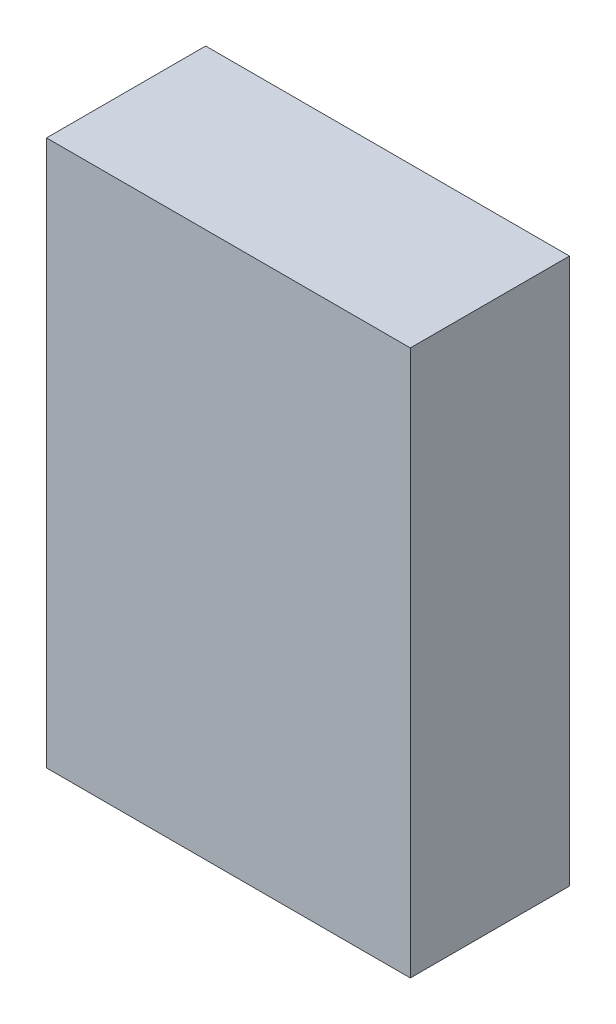
ISO-10303-21;
HEADER;
FILE_DESCRIPTION(('STEP AP214'),'2;1');
FILE_NAME('part.step','',(''),(''),'','','');
FILE_SCHEMA(('AUTOMOTIVE_DESIGN { 1 0 10303 214 1 1 1 1 }'));
ENDSEC;
DATA;
#1=APPLICATION_CONTEXT('core data for automotive mechanical design processes');
#2=APPLICATION_PROTOCOL_DEFINITION('international standard','automotive_design',2000,#1);
#3=PRODUCT_CONTEXT('',#1,'mechanical');
#4=PRODUCT('Part','Part','',(#3));
#5=PRODUCT_RELATED_PRODUCT_CATEGORY('part','',(#4));
#6=PRODUCT_DEFINITION_FORMATION('','',#4);
#7=PRODUCT_DEFINITION_CONTEXT('part definition',#1,'design');
#8=PRODUCT_DEFINITION('design','',#6,#7);
#9=PRODUCT_DEFINITION_SHAPE('','',#8);
#10=(LENGTH_UNIT() NAMED_UNIT(*) SI_UNIT(.MILLI.,.METRE.));
#11=(NAMED_UNIT(*) PLANE_ANGLE_UNIT() SI_UNIT($,.RADIAN.));
#12=(NAMED_UNIT(*) SI_UNIT($,.STERADIAN.) SOLID_ANGLE_UNIT());
#13=UNCERTAINTY_MEASURE_WITH_UNIT(LENGTH_MEASURE(1.E-05),#10,'distance_accuracy_value','');
#14=(GEOMETRIC_REPRESENTATION_CONTEXT(3) GLOBAL_UNCERTAINTY_ASSIGNED_CONTEXT((#13)) GLOBAL_UNIT_ASSIGNED_CONTEXT((#10,
#11,#12)) REPRESENTATION_CONTEXT('',''));
#15=CARTESIAN_POINT('',(0.,0.,0.));
#16=DIRECTION('',(0.,0.,1.));
#17=DIRECTION('',(1.,0.,0.));
#18=AXIS2_PLACEMENT_3D('',#15,#16,#17);
#19=CARTESIAN_POINT('',(0.,0.,0.0875));
#20=DIRECTION('',(0.,0.,1.));
#21=DIRECTION('',(1.,0.,0.));
#22=AXIS2_PLACEMENT_3D('',#19,#20,#21);
#23=PLANE('',#22);
#24=DIRECTION('',(0.,1.,0.));
#25=VECTOR('',#24,1.);
#26=CARTESIAN_POINT('',(0.2,0.,0.0875));
#27=LINE('',#26,#25);
#28=CARTESIAN_POINT('',(0.2,0.3,0.0875));
#29=VERTEX_POINT('',#28);
#30=CARTESIAN_POINT('',(0.2,0.,0.0875));
#31=VERTEX_POINT('',#30);
#32=EDGE_CURVE('E76',#29,#31,#27,.F.);
#33=ORIENTED_EDGE('',*,*,#32,.F.);
#34=DIRECTION('',(1.,0.,0.));
#35=VECTOR('',#34,1.);
#36=CARTESIAN_POINT('',(0.,0.3,0.0875));
#37=LINE('',#36,#35);
#38=CARTESIAN_POINT('',(0.,0.3,0.0875));
#39=VERTEX_POINT('',#38);
#40=EDGE_CURVE('E58',#39,#29,#37,.T.);
#41=ORIENTED_EDGE('',*,*,#40,.F.);
#42=DIRECTION('',(0.,1.,0.));
#43=VECTOR('',#42,1.);
#44=CARTESIAN_POINT('',(0.,0.,0.0875));
#45=LINE('',#44,#43);
#46=CARTESIAN_POINT('',(0.,0.,0.0875));
#47=VERTEX_POINT('',#46);
#48=EDGE_CURVE('E20',#39,#47,#45,.F.);
#49=ORIENTED_EDGE('',*,*,#48,.T.);
#50=DIRECTION('',(1.,0.,0.));
#51=VECTOR('',#50,1.);
#52=CARTESIAN_POINT('',(0.,0.,0.0875));
#53=LINE('',#52,#51);
#54=EDGE_CURVE('E55',#47,#31,#53,.T.);
#55=ORIENTED_EDGE('',*,*,#54,.T.);
#56=EDGE_LOOP('',(#33,#41,#49,#55));
#57=FACE_BOUND('',#56,.T.);
#58=ADVANCED_FACE('F17',(#57),#23,.T.);
#59=CARTESIAN_POINT('',(0.,0.,0.));
#60=DIRECTION('',(1.,0.,0.));
#61=DIRECTION('',(0.,0.,-1.));
#62=AXIS2_PLACEMENT_3D('',#59,#60,#61);
#63=PLANE('',#62);
#64=DIRECTION('',(0.,0.,1.));
#65=VECTOR('',#64,1.);
#66=CARTESIAN_POINT('',(0.,0.3,0.));
#67=LINE('',#66,#65);
#68=CARTESIAN_POINT('',(0.,0.3,0.));
#69=VERTEX_POINT('',#68);
#70=EDGE_CURVE('E78',#69,#39,#67,.T.);
#71=ORIENTED_EDGE('',*,*,#70,.F.);
#72=DIRECTION('',(0.,1.,0.));
#73=VECTOR('',#72,1.);
#74=CARTESIAN_POINT('',(0.,0.,0.));
#75=LINE('',#74,#73);
#76=CARTESIAN_POINT('',(0.,0.,0.));
#77=VERTEX_POINT('',#76);
#78=EDGE_CURVE('E73',#69,#77,#75,.F.);
#79=ORIENTED_EDGE('',*,*,#78,.T.);
#80=DIRECTION('',(0.,0.,1.));
#81=VECTOR('',#80,1.);
#82=CARTESIAN_POINT('',(0.,0.,0.));
#83=LINE('',#82,#81);
#84=EDGE_CURVE('E63',#77,#47,#83,.T.);
#85=ORIENTED_EDGE('',*,*,#84,.T.);
#86=ORIENTED_EDGE('',*,*,#48,.F.);
#87=EDGE_LOOP('',(#71,#79,#85,#86));
#88=FACE_BOUND('',#87,.T.);
#89=ADVANCED_FACE('F72',(#88),#63,.F.);
#90=CARTESIAN_POINT('',(0.,0.,0.));
#91=DIRECTION('',(0.,1.,0.));
#92=DIRECTION('',(0.,0.,1.));
#93=AXIS2_PLACEMENT_3D('',#90,#91,#92);
#94=PLANE('',#93);
#95=ORIENTED_EDGE('',*,*,#54,.F.);
#96=ORIENTED_EDGE('',*,*,#84,.F.);
#97=DIRECTION('',(1.,0.,0.));
#98=VECTOR('',#97,1.);
#99=CARTESIAN_POINT('',(0.,0.,0.));
#100=LINE('',#99,#98);
#101=CARTESIAN_POINT('',(0.2,0.,0.));
#102=VERTEX_POINT('',#101);
#103=EDGE_CURVE('E83',#77,#102,#100,.T.);
#104=ORIENTED_EDGE('',*,*,#103,.T.);
#105=DIRECTION('',(0.,0.,-1.));
#106=VECTOR('',#105,1.);
#107=CARTESIAN_POINT('',(0.2,0.,0.));
#108=LINE('',#107,#106);
#109=EDGE_CURVE('E69',#31,#102,#108,.T.);
#110=ORIENTED_EDGE('',*,*,#109,.F.);
#111=EDGE_LOOP('',(#95,#96,#104,#110));
#112=FACE_BOUND('',#111,.T.);
#113=ADVANCED_FACE('F66',(#112),#94,.F.);
#114=CARTESIAN_POINT('',(0.2,0.,0.));
#115=DIRECTION('',(1.,0.,0.));
#116=DIRECTION('',(0.,0.,-1.));
#117=AXIS2_PLACEMENT_3D('',#114,#115,#116);
#118=PLANE('',#117);
#119=DIRECTION('',(0.,0.,1.));
#120=VECTOR('',#119,1.);
#121=CARTESIAN_POINT('',(0.2,0.3,0.));
#122=LINE('',#121,#120);
#123=CARTESIAN_POINT('',(0.2,0.3,0.));
#124=VERTEX_POINT('',#123);
#125=EDGE_CURVE('E34',#29,#124,#122,.F.);
#126=ORIENTED_EDGE('',*,*,#125,.F.);
#127=ORIENTED_EDGE('',*,*,#32,.T.);
#128=ORIENTED_EDGE('',*,*,#109,.T.);
#129=DIRECTION('',(0.,1.,0.));
#130=VECTOR('',#129,1.);
#131=CARTESIAN_POINT('',(0.2,0.,0.));
#132=LINE('',#131,#130);
#133=EDGE_CURVE('E26',#102,#124,#132,.T.);
#134=ORIENTED_EDGE('',*,*,#133,.T.);
#135=EDGE_LOOP('',(#126,#127,#128,#134));
#136=FACE_BOUND('',#135,.T.);
#137=ADVANCED_FACE('F88',(#136),#118,.T.);
#138=CARTESIAN_POINT('',(0.,0.3,0.));
#139=DIRECTION('',(0.,1.,0.));
#140=DIRECTION('',(0.,0.,1.));
#141=AXIS2_PLACEMENT_3D('',#138,#139,#140);
#142=PLANE('',#141);
#143=ORIENTED_EDGE('',*,*,#40,.T.);
#144=ORIENTED_EDGE('',*,*,#125,.T.);
#145=DIRECTION('',(1.,0.,0.));
#146=VECTOR('',#145,1.);
#147=CARTESIAN_POINT('',(0.,0.3,0.));
#148=LINE('',#147,#146);
#149=EDGE_CURVE('E11',#124,#69,#148,.F.);
#150=ORIENTED_EDGE('',*,*,#149,.T.);
#151=ORIENTED_EDGE('',*,*,#70,.T.);
#152=EDGE_LOOP('',(#143,#144,#150,#151));
#153=FACE_BOUND('',#152,.T.);
#154=ADVANCED_FACE('F91',(#153),#142,.T.);
#155=CARTESIAN_POINT('',(0.,0.,0.));
#156=DIRECTION('',(0.,0.,1.));
#157=DIRECTION('',(1.,0.,0.));
#158=AXIS2_PLACEMENT_3D('',#155,#156,#157);
#159=PLANE('',#158);
#160=ORIENTED_EDGE('',*,*,#133,.F.);
#161=ORIENTED_EDGE('',*,*,#103,.F.);
#162=ORIENTED_EDGE('',*,*,#78,.F.);
#163=ORIENTED_EDGE('',*,*,#149,.F.);
#164=EDGE_LOOP('',(#160,#161,#162,#163));
#165=FACE_BOUND('',#164,.T.);
#166=ADVANCED_FACE('F90',(#165),#159,.F.);
#167=CLOSED_SHELL('',(#58,#89,#113,#137,#154,#166));
#168=MANIFOLD_SOLID_BREP('B1',#167);
#169=ADVANCED_BREP_SHAPE_REPRESENTATION('',(#18,#168),#14);
#170=SHAPE_DEFINITION_REPRESENTATION(#9,#169);
ENDSEC;
END-ISO-10303-21;
